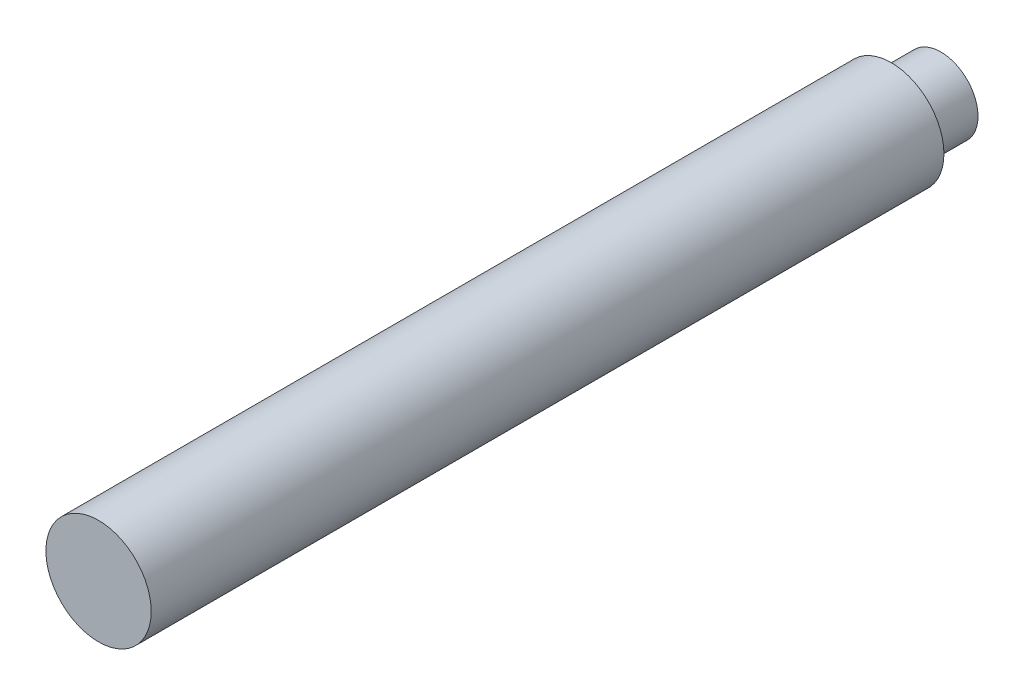
ISO-10303-21;
HEADER;
FILE_DESCRIPTION(('STEP AP214'),'2;1');
FILE_NAME('part.step','',(''),(''),'','','');
FILE_SCHEMA(('AUTOMOTIVE_DESIGN { 1 0 10303 214 1 1 1 1 }'));
ENDSEC;
DATA;
#1=APPLICATION_CONTEXT('core data for automotive mechanical design processes');
#2=APPLICATION_PROTOCOL_DEFINITION('international standard','automotive_design',2000,#1);
#3=PRODUCT_CONTEXT('',#1,'mechanical');
#4=PRODUCT('Part','Part','',(#3));
#5=PRODUCT_RELATED_PRODUCT_CATEGORY('part','',(#4));
#6=PRODUCT_DEFINITION_FORMATION('','',#4);
#7=PRODUCT_DEFINITION_CONTEXT('part definition',#1,'design');
#8=PRODUCT_DEFINITION('design','',#6,#7);
#9=PRODUCT_DEFINITION_SHAPE('','',#8);
#10=(LENGTH_UNIT() NAMED_UNIT(*) SI_UNIT(.MILLI.,.METRE.));
#11=(NAMED_UNIT(*) PLANE_ANGLE_UNIT() SI_UNIT($,.RADIAN.));
#12=(NAMED_UNIT(*) SI_UNIT($,.STERADIAN.) SOLID_ANGLE_UNIT());
#13=UNCERTAINTY_MEASURE_WITH_UNIT(LENGTH_MEASURE(1.E-05),#10,'distance_accuracy_value','');
#14=(GEOMETRIC_REPRESENTATION_CONTEXT(3) GLOBAL_UNCERTAINTY_ASSIGNED_CONTEXT((#13)) GLOBAL_UNIT_ASSIGNED_CONTEXT((#10,
#11,#12)) REPRESENTATION_CONTEXT('',''));
#15=CARTESIAN_POINT('',(0.,0.,0.));
#16=DIRECTION('',(0.,0.,1.));
#17=DIRECTION('',(1.,0.,0.));
#18=AXIS2_PLACEMENT_3D('',#15,#16,#17);
#19=CARTESIAN_POINT('',(0.,0.,0.));
#20=DIRECTION('',(0.,0.,1.));
#21=DIRECTION('',(1.,0.,0.));
#22=AXIS2_PLACEMENT_3D('',#19,#20,#21);
#23=CYLINDRICAL_SURFACE('',#22,4.25);
#24=CARTESIAN_POINT('',(0.,0.,0.));
#25=DIRECTION('',(0.,0.,1.));
#26=DIRECTION('',(1.,0.,0.));
#27=AXIS2_PLACEMENT_3D('',#24,#25,#26);
#28=CIRCLE('',#27,4.25);
#29=CARTESIAN_POINT('',(4.25,0.,0.));
#30=VERTEX_POINT('',#29);
#31=EDGE_CURVE('E12',#30,#30,#28,.T.);
#32=ORIENTED_EDGE('',*,*,#31,.T.);
#33=EDGE_LOOP('',(#32));
#34=FACE_BOUND('',#33,.T.);
#35=CARTESIAN_POINT('',(0.,0.,64.));
#36=DIRECTION('',(0.,0.,1.));
#37=DIRECTION('',(1.,0.,0.));
#38=AXIS2_PLACEMENT_3D('',#35,#36,#37);
#39=CIRCLE('',#38,4.25);
#40=CARTESIAN_POINT('',(4.25,0.,64.));
#41=VERTEX_POINT('',#40);
#42=EDGE_CURVE('E64',#41,#41,#39,.T.);
#43=ORIENTED_EDGE('',*,*,#42,.F.);
#44=EDGE_LOOP('',(#43));
#45=FACE_BOUND('',#44,.T.);
#46=ADVANCED_FACE('F55',(#34,#45),#23,.T.);
#47=CARTESIAN_POINT('',(0.,0.,0.));
#48=DIRECTION('',(0.,0.,1.));
#49=DIRECTION('',(1.,0.,0.));
#50=AXIS2_PLACEMENT_3D('',#47,#48,#49);
#51=PLANE('',#50);
#52=CARTESIAN_POINT('',(0.,0.,0.));
#53=DIRECTION('',(0.,0.,1.));
#54=DIRECTION('',(1.,0.,0.));
#55=AXIS2_PLACEMENT_3D('',#52,#53,#54);
#56=CIRCLE('',#55,3.05);
#57=CARTESIAN_POINT('',(3.05,0.,0.));
#58=VERTEX_POINT('',#57);
#59=EDGE_CURVE('E58',#58,#58,#56,.F.);
#60=ORIENTED_EDGE('',*,*,#59,.F.);
#61=EDGE_LOOP('',(#60));
#62=FACE_BOUND('',#61,.T.);
#63=ORIENTED_EDGE('',*,*,#31,.F.);
#64=EDGE_LOOP('',(#63));
#65=FACE_BOUND('',#64,.T.);
#66=ADVANCED_FACE('F127',(#62,#65),#51,.F.);
#67=CARTESIAN_POINT('',(0.,0.,64.));
#68=DIRECTION('',(0.,0.,1.));
#69=DIRECTION('',(1.,0.,0.));
#70=AXIS2_PLACEMENT_3D('',#67,#68,#69);
#71=PLANE('',#70);
#72=ORIENTED_EDGE('',*,*,#42,.T.);
#73=EDGE_LOOP('',(#72));
#74=FACE_BOUND('',#73,.T.);
#75=ADVANCED_FACE('F132',(#74),#71,.T.);
#76=CARTESIAN_POINT('',(0.,0.,4.));
#77=DIRECTION('',(0.,0.,-1.));
#78=DIRECTION('',(-1.,0.,0.));
#79=AXIS2_PLACEMENT_3D('',#76,#77,#78);
#80=CYLINDRICAL_SURFACE('',#79,3.05);
#81=DIRECTION('',(0.,0.,-1.));
#82=VECTOR('',#81,1.);
#83=CARTESIAN_POINT('',(-2.62678510731274,1.55,4.05));
#84=LINE('',#83,#82);
#85=CARTESIAN_POINT('',(-2.62678510731274,1.55,4.05));
#86=VERTEX_POINT('',#85);
#87=CARTESIAN_POINT('',(-2.62678510731274,1.55,0.05));
#88=VERTEX_POINT('',#87);
#89=EDGE_CURVE('E77',#86,#88,#84,.T.);
#90=ORIENTED_EDGE('',*,*,#89,.F.);
#91=CARTESIAN_POINT('',(0.,0.,4.05));
#92=DIRECTION('',(0.,0.,1.));
#93=DIRECTION('',(1.,0.,0.));
#94=AXIS2_PLACEMENT_3D('',#91,#92,#93);
#95=CIRCLE('',#94,3.05);
#96=CARTESIAN_POINT('',(2.62678510731274,1.55,4.05));
#97=VERTEX_POINT('',#96);
#98=EDGE_CURVE('E71',#86,#97,#95,.T.);
#99=ORIENTED_EDGE('',*,*,#98,.T.);
#100=DIRECTION('',(0.,0.,-1.));
#101=VECTOR('',#100,1.);
#102=CARTESIAN_POINT('',(2.62678510731274,1.55,4.05));
#103=LINE('',#102,#101);
#104=CARTESIAN_POINT('',(2.62678510731274,1.55,0.05));
#105=VERTEX_POINT('',#104);
#106=EDGE_CURVE('E80',#97,#105,#103,.T.);
#107=ORIENTED_EDGE('',*,*,#106,.T.);
#108=CARTESIAN_POINT('',(0.,0.,0.0499999999999997));
#109=DIRECTION('',(0.,0.,1.));
#110=DIRECTION('',(1.,0.,0.));
#111=AXIS2_PLACEMENT_3D('',#108,#109,#110);
#112=CIRCLE('',#111,3.05);
#113=EDGE_CURVE('E85',#105,#88,#112,.T.);
#114=ORIENTED_EDGE('',*,*,#113,.T.);
#115=EDGE_LOOP('',(#90,#99,#107,#114));
#116=FACE_BOUND('',#115,.T.);
#117=ORIENTED_EDGE('',*,*,#59,.T.);
#118=EDGE_LOOP('',(#117));
#119=FACE_BOUND('',#118,.T.);
#120=ADVANCED_FACE('F82',(#116,#119),#80,.F.);
#121=CARTESIAN_POINT('',(0.,1.55,4.));
#122=DIRECTION('',(0.,1.,0.));
#123=DIRECTION('',(0.,0.,1.));
#124=AXIS2_PLACEMENT_3D('',#121,#122,#123);
#125=PLANE('',#124);
#126=DIRECTION('',(1.,0.,0.));
#127=VECTOR('',#126,1.);
#128=CARTESIAN_POINT('',(0.,1.55,0.0499999999999997));
#129=LINE('',#128,#127);
#130=EDGE_CURVE('E92',#88,#105,#129,.T.);
#131=ORIENTED_EDGE('',*,*,#130,.T.);
#132=ORIENTED_EDGE('',*,*,#106,.F.);
#133=DIRECTION('',(1.,0.,0.));
#134=VECTOR('',#133,1.);
#135=CARTESIAN_POINT('',(0.,1.55,4.05));
#136=LINE('',#135,#134);
#137=EDGE_CURVE('E96',#86,#97,#136,.T.);
#138=ORIENTED_EDGE('',*,*,#137,.F.);
#139=ORIENTED_EDGE('',*,*,#89,.T.);
#140=EDGE_LOOP('',(#131,#132,#138,#139));
#141=FACE_BOUND('',#140,.T.);
#142=ADVANCED_FACE('F93',(#141),#125,.F.);
#143=CARTESIAN_POINT('',(0.,0.,4.05));
#144=DIRECTION('',(0.,0.,1.));
#145=DIRECTION('',(1.,0.,0.));
#146=AXIS2_PLACEMENT_3D('',#143,#144,#145);
#147=PLANE('',#146);
#148=ORIENTED_EDGE('',*,*,#137,.T.);
#149=ORIENTED_EDGE('',*,*,#98,.F.);
#150=EDGE_LOOP('',(#148,#149));
#151=FACE_BOUND('',#150,.T.);
#152=ADVANCED_FACE('F116',(#151),#147,.F.);
#153=CARTESIAN_POINT('',(0.,0.,0.05));
#154=DIRECTION('',(0.,0.,1.));
#155=DIRECTION('',(1.,0.,0.));
#156=AXIS2_PLACEMENT_3D('',#153,#154,#155);
#157=PLANE('',#156);
#158=ORIENTED_EDGE('',*,*,#113,.F.);
#159=ORIENTED_EDGE('',*,*,#130,.F.);
#160=EDGE_LOOP('',(#158,#159));
#161=FACE_BOUND('',#160,.T.);
#162=ADVANCED_FACE('F98',(#161),#157,.F.);
#163=CLOSED_SHELL('',(#46,#66,#75,#120,#142,#152,#162));
#164=MANIFOLD_SOLID_BREP('B2',#163);
#165=CARTESIAN_POINT('',(0.,1.5,4.));
#166=DIRECTION('',(0.,1.,0.));
#167=DIRECTION('',(0.,0.,1.));
#168=AXIS2_PLACEMENT_3D('',#165,#166,#167);
#169=PLANE('',#168);
#170=DIRECTION('',(1.,0.,0.));
#171=VECTOR('',#170,1.);
#172=CARTESIAN_POINT('',(0.,1.5,0.));
#173=LINE('',#172,#171);
#174=CARTESIAN_POINT('',(-2.59807621135332,1.5,0.));
#175=VERTEX_POINT('',#174);
#176=CARTESIAN_POINT('',(2.59807621135332,1.5,0.));
#177=VERTEX_POINT('',#176);
#178=EDGE_CURVE('E228',#175,#177,#173,.T.);
#179=ORIENTED_EDGE('',*,*,#178,.F.);
#180=DIRECTION('',(0.,0.,-1.));
#181=VECTOR('',#180,1.);
#182=CARTESIAN_POINT('',(-2.59807621135332,1.5,4.));
#183=LINE('',#182,#181);
#184=CARTESIAN_POINT('',(-2.59807621135332,1.5,4.));
#185=VERTEX_POINT('',#184);
#186=EDGE_CURVE('E53',#185,#175,#183,.T.);
#187=ORIENTED_EDGE('',*,*,#186,.F.);
#188=DIRECTION('',(1.,0.,0.));
#189=VECTOR('',#188,1.);
#190=CARTESIAN_POINT('',(0.,1.5,4.));
#191=LINE('',#190,#189);
#192=CARTESIAN_POINT('',(2.59807621135332,1.5,4.));
#193=VERTEX_POINT('',#192);
#194=EDGE_CURVE('E230',#185,#193,#191,.T.);
#195=ORIENTED_EDGE('',*,*,#194,.T.);
#196=DIRECTION('',(0.,0.,-1.));
#197=VECTOR('',#196,1.);
#198=CARTESIAN_POINT('',(2.59807621135332,1.5,4.));
#199=LINE('',#198,#197);
#200=EDGE_CURVE('E205',#193,#177,#199,.T.);
#201=ORIENTED_EDGE('',*,*,#200,.T.);
#202=EDGE_LOOP('',(#179,#187,#195,#201));
#203=FACE_BOUND('',#202,.T.);
#204=ADVANCED_FACE('F197',(#203),#169,.T.);
#205=CARTESIAN_POINT('',(0.,0.,4.));
#206=DIRECTION('',(0.,0.,-1.));
#207=DIRECTION('',(-1.,0.,0.));
#208=AXIS2_PLACEMENT_3D('',#205,#206,#207);
#209=CYLINDRICAL_SURFACE('',#208,3.);
#210=ORIENTED_EDGE('',*,*,#186,.T.);
#211=CARTESIAN_POINT('',(0.,0.,0.));
#212=DIRECTION('',(0.,0.,1.));
#213=DIRECTION('',(1.,0.,0.));
#214=AXIS2_PLACEMENT_3D('',#211,#212,#213);
#215=CIRCLE('',#214,3.);
#216=EDGE_CURVE('E227',#177,#175,#215,.T.);
#217=ORIENTED_EDGE('',*,*,#216,.F.);
#218=ORIENTED_EDGE('',*,*,#200,.F.);
#219=CARTESIAN_POINT('',(0.,0.,4.));
#220=DIRECTION('',(0.,0.,1.));
#221=DIRECTION('',(1.,0.,0.));
#222=AXIS2_PLACEMENT_3D('',#219,#220,#221);
#223=CIRCLE('',#222,3.);
#224=EDGE_CURVE('E211',#185,#193,#223,.T.);
#225=ORIENTED_EDGE('',*,*,#224,.F.);
#226=EDGE_LOOP('',(#210,#217,#218,#225));
#227=FACE_BOUND('',#226,.T.);
#228=CARTESIAN_POINT('',(0.,0.,-4.));
#229=DIRECTION('',(0.,0.,1.));
#230=DIRECTION('',(1.,0.,0.));
#231=AXIS2_PLACEMENT_3D('',#228,#229,#230);
#232=CIRCLE('',#231,3.);
#233=CARTESIAN_POINT('',(3.,0.,-4.));
#234=VERTEX_POINT('',#233);
#235=EDGE_CURVE('E231',#234,#234,#232,.T.);
#236=ORIENTED_EDGE('',*,*,#235,.T.);
#237=EDGE_LOOP('',(#236));
#238=FACE_BOUND('',#237,.T.);
#239=ADVANCED_FACE('F224',(#227,#238),#209,.T.);
#240=CARTESIAN_POINT('',(0.,0.,4.));
#241=DIRECTION('',(0.,0.,1.));
#242=DIRECTION('',(1.,0.,0.));
#243=AXIS2_PLACEMENT_3D('',#240,#241,#242);
#244=PLANE('',#243);
#245=ORIENTED_EDGE('',*,*,#194,.F.);
#246=ORIENTED_EDGE('',*,*,#224,.T.);
#247=EDGE_LOOP('',(#245,#246));
#248=FACE_BOUND('',#247,.T.);
#249=ADVANCED_FACE('F239',(#248),#244,.T.);
#250=CARTESIAN_POINT('',(0.,0.,-4.));
#251=DIRECTION('',(0.,0.,1.));
#252=DIRECTION('',(1.,0.,0.));
#253=AXIS2_PLACEMENT_3D('',#250,#251,#252);
#254=PLANE('',#253);
#255=ORIENTED_EDGE('',*,*,#235,.F.);
#256=EDGE_LOOP('',(#255));
#257=FACE_BOUND('',#256,.T.);
#258=ADVANCED_FACE('F241',(#257),#254,.F.);
#259=CARTESIAN_POINT('',(0.,0.,0.));
#260=DIRECTION('',(0.,0.,1.));
#261=DIRECTION('',(1.,0.,0.));
#262=AXIS2_PLACEMENT_3D('',#259,#260,#261);
#263=PLANE('',#262);
#264=ORIENTED_EDGE('',*,*,#216,.T.);
#265=ORIENTED_EDGE('',*,*,#178,.T.);
#266=EDGE_LOOP('',(#264,#265));
#267=FACE_BOUND('',#266,.T.);
#268=ADVANCED_FACE('F233',(#267),#263,.T.);
#269=CLOSED_SHELL('',(#204,#239,#249,#258,#268));
#270=MANIFOLD_SOLID_BREP('B6_NOT_SHOWN',#269);
#271=ADVANCED_BREP_SHAPE_REPRESENTATION('',(#18,#164,#270),#14);
#272=SHAPE_DEFINITION_REPRESENTATION(#9,#271);
ENDSEC;
END-ISO-10303-21;
